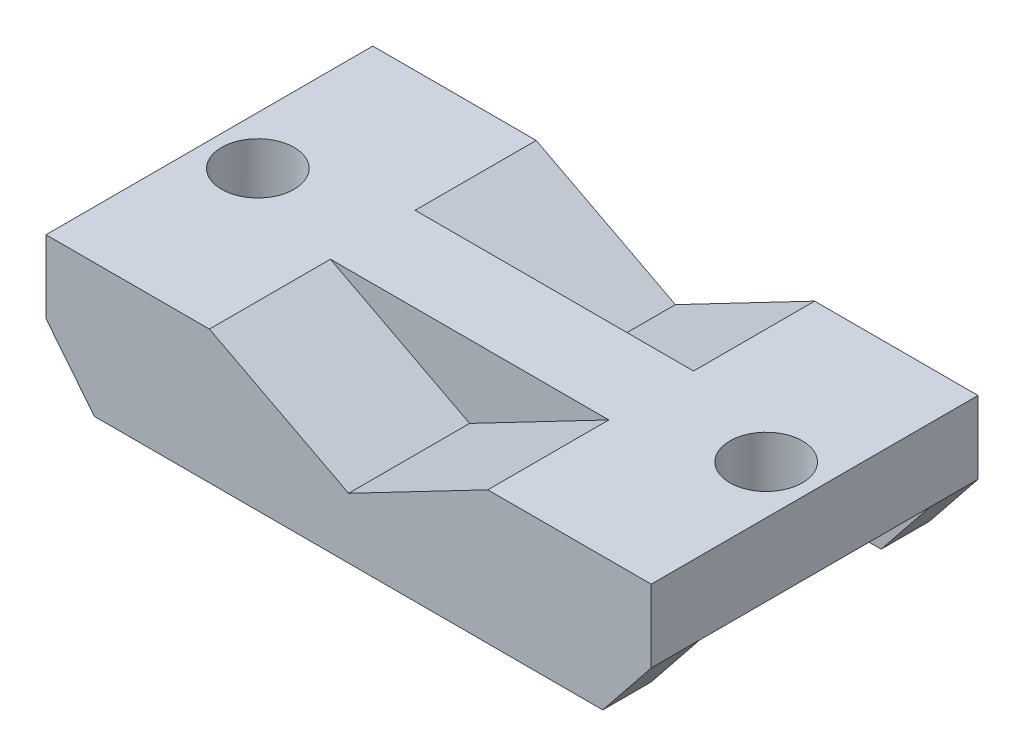
ISO-10303-21;
HEADER;
FILE_DESCRIPTION(('STEP AP214'),'2;1');
FILE_NAME('part.step','',(''),(''),'','','');
FILE_SCHEMA(('AUTOMOTIVE_DESIGN { 1 0 10303 214 1 1 1 1 }'));
ENDSEC;
DATA;
#1=APPLICATION_CONTEXT('core data for automotive mechanical design processes');
#2=APPLICATION_PROTOCOL_DEFINITION('international standard','automotive_design',2000,#1);
#3=PRODUCT_CONTEXT('',#1,'mechanical');
#4=PRODUCT('Part','Part','',(#3));
#5=PRODUCT_RELATED_PRODUCT_CATEGORY('part','',(#4));
#6=PRODUCT_DEFINITION_FORMATION('','',#4);
#7=PRODUCT_DEFINITION_CONTEXT('part definition',#1,'design');
#8=PRODUCT_DEFINITION('design','',#6,#7);
#9=PRODUCT_DEFINITION_SHAPE('','',#8);
#10=(LENGTH_UNIT() NAMED_UNIT(*) SI_UNIT(.MILLI.,.METRE.));
#11=(NAMED_UNIT(*) PLANE_ANGLE_UNIT() SI_UNIT($,.RADIAN.));
#12=(NAMED_UNIT(*) SI_UNIT($,.STERADIAN.) SOLID_ANGLE_UNIT());
#13=UNCERTAINTY_MEASURE_WITH_UNIT(LENGTH_MEASURE(1.E-05),#10,'distance_accuracy_value','');
#14=(GEOMETRIC_REPRESENTATION_CONTEXT(3) GLOBAL_UNCERTAINTY_ASSIGNED_CONTEXT((#13)) GLOBAL_UNIT_ASSIGNED_CONTEXT((#10,
#11,#12)) REPRESENTATION_CONTEXT('',''));
#15=CARTESIAN_POINT('',(0.,0.,0.));
#16=DIRECTION('',(0.,0.,1.));
#17=DIRECTION('',(1.,0.,0.));
#18=AXIS2_PLACEMENT_3D('',#15,#16,#17);
#19=CARTESIAN_POINT('',(30.4878048780488,-24.390243902439,27.));
#20=DIRECTION('',(0.780868809443031,-0.624695047554424,0.));
#21=DIRECTION('',(0.624695047554424,0.780868809443031,0.));
#22=AXIS2_PLACEMENT_3D('',#19,#20,#21);
#23=PLANE('',#22);
#24=DIRECTION('',(0.,0.,-1.));
#25=VECTOR('',#24,1.);
#26=CARTESIAN_POINT('',(42.,-10.,27.));
#27=LINE('',#26,#25);
#28=CARTESIAN_POINT('',(42.,-10.,27.));
#29=VERTEX_POINT('',#28);
#30=CARTESIAN_POINT('',(42.,-10.,19.));
#31=VERTEX_POINT('',#30);
#32=EDGE_CURVE('E377',#29,#31,#27,.T.);
#33=ORIENTED_EDGE('',*,*,#32,.T.);
#34=DIRECTION('',(0.624695047554424,0.780868809443031,0.));
#35=VECTOR('',#34,1.);
#36=CARTESIAN_POINT('',(30.4878048780488,-24.390243902439,19.));
#37=LINE('',#36,#35);
#38=CARTESIAN_POINT('',(50.,0.,19.));
#39=VERTEX_POINT('',#38);
#40=EDGE_CURVE('E57',#31,#39,#37,.T.);
#41=ORIENTED_EDGE('',*,*,#40,.T.);
#42=DIRECTION('',(0.,0.,-1.));
#43=VECTOR('',#42,1.);
#44=CARTESIAN_POINT('',(50.,0.,27.));
#45=LINE('',#44,#43);
#46=CARTESIAN_POINT('',(50.,0.,27.));
#47=VERTEX_POINT('',#46);
#48=EDGE_CURVE('E372',#47,#39,#45,.T.);
#49=ORIENTED_EDGE('',*,*,#48,.F.);
#50=DIRECTION('',(-0.624695047554424,-0.780868809443031,0.));
#51=VECTOR('',#50,1.);
#52=CARTESIAN_POINT('',(30.4878048780488,-24.390243902439,27.));
#53=LINE('',#52,#51);
#54=EDGE_CURVE('E294',#47,#29,#53,.T.);
#55=ORIENTED_EDGE('',*,*,#54,.T.);
#56=EDGE_LOOP('',(#33,#41,#49,#55));
#57=FACE_BOUND('',#56,.T.);
#58=ADVANCED_FACE('F47',(#57),#23,.T.);
#59=CARTESIAN_POINT('',(-30.4878048780488,-24.390243902439,27.));
#60=DIRECTION('',(0.780868809443031,0.624695047554424,0.));
#61=DIRECTION('',(-0.624695047554424,0.780868809443031,0.));
#62=AXIS2_PLACEMENT_3D('',#59,#60,#61);
#63=PLANE('',#62);
#64=DIRECTION('',(-0.624695047554424,0.780868809443031,0.));
#65=VECTOR('',#64,1.);
#66=CARTESIAN_POINT('',(-30.4878048780488,-24.390243902439,19.));
#67=LINE('',#66,#65);
#68=CARTESIAN_POINT('',(-42.,-10.,19.));
#69=VERTEX_POINT('',#68);
#70=CARTESIAN_POINT('',(-50.,0.,19.));
#71=VERTEX_POINT('',#70);
#72=EDGE_CURVE('E247',#69,#71,#67,.T.);
#73=ORIENTED_EDGE('',*,*,#72,.F.);
#74=DIRECTION('',(0.,0.,-1.));
#75=VECTOR('',#74,1.);
#76=CARTESIAN_POINT('',(-42.,-10.,27.));
#77=LINE('',#76,#75);
#78=CARTESIAN_POINT('',(-42.,-10.,27.));
#79=VERTEX_POINT('',#78);
#80=EDGE_CURVE('E382',#79,#69,#77,.T.);
#81=ORIENTED_EDGE('',*,*,#80,.F.);
#82=DIRECTION('',(0.624695047554424,-0.780868809443031,0.));
#83=VECTOR('',#82,1.);
#84=CARTESIAN_POINT('',(-30.4878048780488,-24.390243902439,27.));
#85=LINE('',#84,#83);
#86=CARTESIAN_POINT('',(-50.,0.,27.));
#87=VERTEX_POINT('',#86);
#88=EDGE_CURVE('E286',#87,#79,#85,.T.);
#89=ORIENTED_EDGE('',*,*,#88,.F.);
#90=DIRECTION('',(0.,0.,-1.));
#91=VECTOR('',#90,1.);
#92=CARTESIAN_POINT('',(-50.,0.,27.));
#93=LINE('',#92,#91);
#94=EDGE_CURVE('E387',#87,#71,#93,.T.);
#95=ORIENTED_EDGE('',*,*,#94,.T.);
#96=EDGE_LOOP('',(#73,#81,#89,#95));
#97=FACE_BOUND('',#96,.T.);
#98=ADVANCED_FACE('F480',(#97),#63,.F.);
#99=CARTESIAN_POINT('',(0.,0.,27.));
#100=DIRECTION('',(-0.46256600669502,0.886584846165455,0.));
#101=DIRECTION('',(-0.886584846165455,-0.46256600669502,0.));
#102=AXIS2_PLACEMENT_3D('',#99,#100,#101);
#103=PLANE('',#102);
#104=DIRECTION('',(0.,0.,-1.));
#105=VECTOR('',#104,1.);
#106=CARTESIAN_POINT('',(0.,0.,27.));
#107=LINE('',#106,#105);
#108=CARTESIAN_POINT('',(0.,0.,-7.));
#109=VERTEX_POINT('',#108);
#110=CARTESIAN_POINT('',(0.,0.,-27.));
#111=VERTEX_POINT('',#110);
#112=EDGE_CURVE('E358',#109,#111,#107,.T.);
#113=ORIENTED_EDGE('',*,*,#112,.F.);
#114=DIRECTION('',(0.886584846165455,0.46256600669502,0.));
#115=VECTOR('',#114,1.);
#116=CARTESIAN_POINT('',(0.,0.,-7.));
#117=LINE('',#116,#115);
#118=CARTESIAN_POINT('',(23.,12.,-7.));
#119=VERTEX_POINT('',#118);
#120=EDGE_CURVE('E265',#109,#119,#117,.T.);
#121=ORIENTED_EDGE('',*,*,#120,.T.);
#122=DIRECTION('',(0.,0.,-1.));
#123=VECTOR('',#122,1.);
#124=CARTESIAN_POINT('',(23.,12.,27.));
#125=LINE('',#124,#123);
#126=CARTESIAN_POINT('',(23.,12.,-27.));
#127=VERTEX_POINT('',#126);
#128=EDGE_CURVE('E363',#119,#127,#125,.T.);
#129=ORIENTED_EDGE('',*,*,#128,.T.);
#130=DIRECTION('',(0.886584846165455,0.46256600669502,0.));
#131=VECTOR('',#130,1.);
#132=CARTESIAN_POINT('',(0.,0.,-27.));
#133=LINE('',#132,#131);
#134=EDGE_CURVE('E340',#111,#127,#133,.T.);
#135=ORIENTED_EDGE('',*,*,#134,.F.);
#136=EDGE_LOOP('',(#113,#121,#129,#135));
#137=FACE_BOUND('',#136,.T.);
#138=ADVANCED_FACE('F453',(#137),#103,.T.);
#139=CARTESIAN_POINT('',(0.,0.,27.));
#140=DIRECTION('',(-0.46256600669502,-0.886584846165455,0.));
#141=DIRECTION('',(0.886584846165455,-0.46256600669502,0.));
#142=AXIS2_PLACEMENT_3D('',#139,#140,#141);
#143=PLANE('',#142);
#144=DIRECTION('',(-0.886584846165455,0.46256600669502,0.));
#145=VECTOR('',#144,1.);
#146=CARTESIAN_POINT('',(0.,0.,-7.));
#147=LINE('',#146,#145);
#148=CARTESIAN_POINT('',(-23.,12.,-7.));
#149=VERTEX_POINT('',#148);
#150=EDGE_CURVE('E276',#109,#149,#147,.T.);
#151=ORIENTED_EDGE('',*,*,#150,.F.);
#152=ORIENTED_EDGE('',*,*,#112,.T.);
#153=DIRECTION('',(-0.886584846165455,0.46256600669502,0.));
#154=VECTOR('',#153,1.);
#155=CARTESIAN_POINT('',(0.,0.,-27.));
#156=LINE('',#155,#154);
#157=CARTESIAN_POINT('',(-23.,12.,-27.));
#158=VERTEX_POINT('',#157);
#159=EDGE_CURVE('E344',#111,#158,#156,.T.);
#160=ORIENTED_EDGE('',*,*,#159,.T.);
#161=DIRECTION('',(0.,0.,-1.));
#162=VECTOR('',#161,1.);
#163=CARTESIAN_POINT('',(-23.,12.,27.));
#164=LINE('',#163,#162);
#165=EDGE_CURVE('E353',#149,#158,#164,.T.);
#166=ORIENTED_EDGE('',*,*,#165,.F.);
#167=EDGE_LOOP('',(#151,#152,#160,#166));
#168=FACE_BOUND('',#167,.T.);
#169=ADVANCED_FACE('F450',(#168),#143,.F.);
#170=CARTESIAN_POINT('',(-50.,0.,27.));
#171=DIRECTION('',(1.,0.,0.));
#172=DIRECTION('',(0.,0.,-1.));
#173=AXIS2_PLACEMENT_3D('',#170,#171,#172);
#174=PLANE('',#173);
#175=DIRECTION('',(0.,-1.,0.));
#176=VECTOR('',#175,1.);
#177=CARTESIAN_POINT('',(-50.,0.,-27.));
#178=LINE('',#177,#176);
#179=CARTESIAN_POINT('',(-50.,12.,-27.));
#180=VERTEX_POINT('',#179);
#181=CARTESIAN_POINT('',(-50.,0.,-27.));
#182=VERTEX_POINT('',#181);
#183=EDGE_CURVE('E272',#180,#182,#178,.T.);
#184=ORIENTED_EDGE('',*,*,#183,.T.);
#185=CARTESIAN_POINT('',(-50.,0.,-19.));
#186=VERTEX_POINT('',#185);
#187=EDGE_CURVE('E386',#186,#182,#93,.T.);
#188=ORIENTED_EDGE('',*,*,#187,.F.);
#189=DIRECTION('',(0.,0.,1.));
#190=VECTOR('',#189,1.);
#191=CARTESIAN_POINT('',(-50.,0.,-19.));
#192=LINE('',#191,#190);
#193=EDGE_CURVE('E243',#186,#71,#192,.T.);
#194=ORIENTED_EDGE('',*,*,#193,.T.);
#195=ORIENTED_EDGE('',*,*,#94,.F.);
#196=DIRECTION('',(0.,-1.,0.));
#197=VECTOR('',#196,1.);
#198=CARTESIAN_POINT('',(-50.,0.,27.));
#199=LINE('',#198,#197);
#200=CARTESIAN_POINT('',(-50.,12.,27.));
#201=VERTEX_POINT('',#200);
#202=EDGE_CURVE('E282',#201,#87,#199,.T.);
#203=ORIENTED_EDGE('',*,*,#202,.F.);
#204=DIRECTION('',(0.,0.,-1.));
#205=VECTOR('',#204,1.);
#206=CARTESIAN_POINT('',(-50.,12.,27.));
#207=LINE('',#206,#205);
#208=EDGE_CURVE('E316',#201,#180,#207,.T.);
#209=ORIENTED_EDGE('',*,*,#208,.T.);
#210=EDGE_LOOP('',(#184,#188,#194,#195,#203,#209));
#211=FACE_BOUND('',#210,.T.);
#212=ADVANCED_FACE('F49',(#211),#174,.F.);
#213=CARTESIAN_POINT('',(-42.,-10.,-19.));
#214=VERTEX_POINT('',#213);
#215=CARTESIAN_POINT('',(-42.,-10.,-27.));
#216=VERTEX_POINT('',#215);
#217=EDGE_CURVE('E381',#214,#216,#77,.T.);
#218=ORIENTED_EDGE('',*,*,#217,.F.);
#219=DIRECTION('',(-0.624695047554424,0.780868809443031,0.));
#220=VECTOR('',#219,1.);
#221=CARTESIAN_POINT('',(-30.4878048780488,-24.390243902439,-19.));
#222=LINE('',#221,#220);
#223=EDGE_CURVE('E256',#214,#186,#222,.T.);
#224=ORIENTED_EDGE('',*,*,#223,.T.);
#225=ORIENTED_EDGE('',*,*,#187,.T.);
#226=DIRECTION('',(0.624695047554424,-0.780868809443031,0.));
#227=VECTOR('',#226,1.);
#228=CARTESIAN_POINT('',(-30.4878048780488,-24.390243902439,-27.));
#229=LINE('',#228,#227);
#230=EDGE_CURVE('E320',#182,#216,#229,.T.);
#231=ORIENTED_EDGE('',*,*,#230,.T.);
#232=EDGE_LOOP('',(#218,#224,#225,#231));
#233=FACE_BOUND('',#232,.T.);
#234=ADVANCED_FACE('F439',(#233),#63,.F.);
#235=CARTESIAN_POINT('',(0.,-10.,27.));
#236=DIRECTION('',(0.,-1.,0.));
#237=DIRECTION('',(0.,0.,-1.));
#238=AXIS2_PLACEMENT_3D('',#235,#236,#237);
#239=PLANE('',#238);
#240=DIRECTION('',(-1.,0.,0.));
#241=VECTOR('',#240,1.);
#242=CARTESIAN_POINT('',(32.,-10.,-19.));
#243=LINE('',#242,#241);
#244=CARTESIAN_POINT('',(42.,-10.,-19.));
#245=VERTEX_POINT('',#244);
#246=CARTESIAN_POINT('',(32.,-10.,-19.));
#247=VERTEX_POINT('',#246);
#248=EDGE_CURVE('E209',#245,#247,#243,.T.);
#249=ORIENTED_EDGE('',*,*,#248,.T.);
#250=DIRECTION('',(0.,0.,1.));
#251=VECTOR('',#250,1.);
#252=CARTESIAN_POINT('',(32.,-10.,-19.));
#253=LINE('',#252,#251);
#254=CARTESIAN_POINT('',(32.,-10.,19.));
#255=VERTEX_POINT('',#254);
#256=EDGE_CURVE('E194',#247,#255,#253,.T.);
#257=ORIENTED_EDGE('',*,*,#256,.T.);
#258=DIRECTION('',(1.,0.,0.));
#259=VECTOR('',#258,1.);
#260=CARTESIAN_POINT('',(32.,-10.,19.));
#261=LINE('',#260,#259);
#262=EDGE_CURVE('E212',#255,#31,#261,.T.);
#263=ORIENTED_EDGE('',*,*,#262,.T.);
#264=ORIENTED_EDGE('',*,*,#32,.F.);
#265=DIRECTION('',(-1.,0.,0.));
#266=VECTOR('',#265,1.);
#267=CARTESIAN_POINT('',(0.,-10.,27.));
#268=LINE('',#267,#266);
#269=EDGE_CURVE('E290',#29,#79,#268,.T.);
#270=ORIENTED_EDGE('',*,*,#269,.T.);
#271=ORIENTED_EDGE('',*,*,#80,.T.);
#272=DIRECTION('',(-1.,0.,0.));
#273=VECTOR('',#272,1.);
#274=CARTESIAN_POINT('',(-32.,-10.,19.));
#275=LINE('',#274,#273);
#276=CARTESIAN_POINT('',(-32.,-10.,19.));
#277=VERTEX_POINT('',#276);
#278=EDGE_CURVE('E225',#277,#69,#275,.T.);
#279=ORIENTED_EDGE('',*,*,#278,.F.);
#280=DIRECTION('',(0.,0.,1.));
#281=VECTOR('',#280,1.);
#282=CARTESIAN_POINT('',(-32.,-10.,-19.));
#283=LINE('',#282,#281);
#284=CARTESIAN_POINT('',(-32.,-10.,-19.));
#285=VERTEX_POINT('',#284);
#286=EDGE_CURVE('E72',#285,#277,#283,.T.);
#287=ORIENTED_EDGE('',*,*,#286,.F.);
#288=DIRECTION('',(1.,0.,0.));
#289=VECTOR('',#288,1.);
#290=CARTESIAN_POINT('',(0.,-10.,-19.));
#291=LINE('',#290,#289);
#292=EDGE_CURVE('E391',#214,#285,#291,.T.);
#293=ORIENTED_EDGE('',*,*,#292,.F.);
#294=ORIENTED_EDGE('',*,*,#217,.T.);
#295=DIRECTION('',(-1.,0.,0.));
#296=VECTOR('',#295,1.);
#297=CARTESIAN_POINT('',(0.,-10.,-27.));
#298=LINE('',#297,#296);
#299=CARTESIAN_POINT('',(42.,-10.,-27.));
#300=VERTEX_POINT('',#299);
#301=EDGE_CURVE('E324',#300,#216,#298,.T.);
#302=ORIENTED_EDGE('',*,*,#301,.F.);
#303=EDGE_CURVE('E376',#245,#300,#27,.T.);
#304=ORIENTED_EDGE('',*,*,#303,.F.);
#305=EDGE_LOOP('',(#249,#257,#263,#264,#270,#271,#279,#287,#293,#294,#302,#304));
#306=FACE_BOUND('',#305,.T.);
#307=ADVANCED_FACE('F466',(#306),#239,.T.);
#308=DIRECTION('',(0.624695047554424,0.780868809443031,0.));
#309=VECTOR('',#308,1.);
#310=CARTESIAN_POINT('',(30.4878048780488,-24.390243902439,-19.));
#311=LINE('',#310,#309);
#312=CARTESIAN_POINT('',(50.,0.,-19.));
#313=VERTEX_POINT('',#312);
#314=EDGE_CURVE('E11',#245,#313,#311,.T.);
#315=ORIENTED_EDGE('',*,*,#314,.F.);
#316=ORIENTED_EDGE('',*,*,#303,.T.);
#317=DIRECTION('',(-0.624695047554424,-0.780868809443031,0.));
#318=VECTOR('',#317,1.);
#319=CARTESIAN_POINT('',(30.4878048780488,-24.390243902439,-27.));
#320=LINE('',#319,#318);
#321=CARTESIAN_POINT('',(50.,0.,-27.));
#322=VERTEX_POINT('',#321);
#323=EDGE_CURVE('E328',#322,#300,#320,.T.);
#324=ORIENTED_EDGE('',*,*,#323,.F.);
#325=EDGE_CURVE('E371',#313,#322,#45,.T.);
#326=ORIENTED_EDGE('',*,*,#325,.F.);
#327=EDGE_LOOP('',(#315,#316,#324,#326));
#328=FACE_BOUND('',#327,.T.);
#329=ADVANCED_FACE('F463',(#328),#23,.T.);
#330=CARTESIAN_POINT('',(50.,0.,27.));
#331=DIRECTION('',(1.,0.,0.));
#332=DIRECTION('',(0.,0.,-1.));
#333=AXIS2_PLACEMENT_3D('',#330,#331,#332);
#334=PLANE('',#333);
#335=DIRECTION('',(0.,-1.,0.));
#336=VECTOR('',#335,1.);
#337=CARTESIAN_POINT('',(50.,0.,-27.));
#338=LINE('',#337,#336);
#339=CARTESIAN_POINT('',(50.,12.,-27.));
#340=VERTEX_POINT('',#339);
#341=EDGE_CURVE('E332',#340,#322,#338,.T.);
#342=ORIENTED_EDGE('',*,*,#341,.F.);
#343=DIRECTION('',(0.,0.,-1.));
#344=VECTOR('',#343,1.);
#345=CARTESIAN_POINT('',(50.,12.,27.));
#346=LINE('',#345,#344);
#347=CARTESIAN_POINT('',(50.,12.,27.));
#348=VERTEX_POINT('',#347);
#349=EDGE_CURVE('E368',#348,#340,#346,.T.);
#350=ORIENTED_EDGE('',*,*,#349,.F.);
#351=DIRECTION('',(0.,-1.,0.));
#352=VECTOR('',#351,1.);
#353=CARTESIAN_POINT('',(50.,0.,27.));
#354=LINE('',#353,#352);
#355=EDGE_CURVE('E298',#348,#47,#354,.T.);
#356=ORIENTED_EDGE('',*,*,#355,.T.);
#357=ORIENTED_EDGE('',*,*,#48,.T.);
#358=DIRECTION('',(0.,0.,1.));
#359=VECTOR('',#358,1.);
#360=CARTESIAN_POINT('',(50.,0.,-19.));
#361=LINE('',#360,#359);
#362=EDGE_CURVE('E195',#313,#39,#361,.T.);
#363=ORIENTED_EDGE('',*,*,#362,.F.);
#364=ORIENTED_EDGE('',*,*,#325,.T.);
#365=EDGE_LOOP('',(#342,#350,#356,#357,#363,#364));
#366=FACE_BOUND('',#365,.T.);
#367=ADVANCED_FACE('F459',(#366),#334,.T.);
#368=DIRECTION('',(0.886584846165455,0.46256600669502,0.));
#369=VECTOR('',#368,1.);
#370=CARTESIAN_POINT('',(0.,0.,7.));
#371=LINE('',#370,#369);
#372=CARTESIAN_POINT('',(0.,0.,7.));
#373=VERTEX_POINT('',#372);
#374=CARTESIAN_POINT('',(23.,12.,7.));
#375=VERTEX_POINT('',#374);
#376=EDGE_CURVE('E269',#373,#375,#371,.T.);
#377=ORIENTED_EDGE('',*,*,#376,.F.);
#378=CARTESIAN_POINT('',(0.,0.,27.));
#379=VERTEX_POINT('',#378);
#380=EDGE_CURVE('E359',#379,#373,#107,.T.);
#381=ORIENTED_EDGE('',*,*,#380,.F.);
#382=DIRECTION('',(0.886584846165455,0.46256600669502,0.));
#383=VECTOR('',#382,1.);
#384=CARTESIAN_POINT('',(0.,0.,27.));
#385=LINE('',#384,#383);
#386=CARTESIAN_POINT('',(23.,12.,27.));
#387=VERTEX_POINT('',#386);
#388=EDGE_CURVE('E306',#379,#387,#385,.T.);
#389=ORIENTED_EDGE('',*,*,#388,.T.);
#390=EDGE_CURVE('E364',#387,#375,#125,.T.);
#391=ORIENTED_EDGE('',*,*,#390,.T.);
#392=EDGE_LOOP('',(#377,#381,#389,#391));
#393=FACE_BOUND('',#392,.T.);
#394=ADVANCED_FACE('F493',(#393),#103,.T.);
#395=ORIENTED_EDGE('',*,*,#380,.T.);
#396=DIRECTION('',(-0.886584846165455,0.46256600669502,0.));
#397=VECTOR('',#396,1.);
#398=CARTESIAN_POINT('',(0.,0.,7.));
#399=LINE('',#398,#397);
#400=CARTESIAN_POINT('',(-23.,12.,7.));
#401=VERTEX_POINT('',#400);
#402=EDGE_CURVE('E264',#373,#401,#399,.T.);
#403=ORIENTED_EDGE('',*,*,#402,.T.);
#404=CARTESIAN_POINT('',(-23.,12.,27.));
#405=VERTEX_POINT('',#404);
#406=EDGE_CURVE('E354',#405,#401,#164,.T.);
#407=ORIENTED_EDGE('',*,*,#406,.F.);
#408=DIRECTION('',(-0.886584846165455,0.46256600669502,0.));
#409=VECTOR('',#408,1.);
#410=CARTESIAN_POINT('',(0.,0.,27.));
#411=LINE('',#410,#409);
#412=EDGE_CURVE('E310',#379,#405,#411,.T.);
#413=ORIENTED_EDGE('',*,*,#412,.F.);
#414=EDGE_LOOP('',(#395,#403,#407,#413));
#415=FACE_BOUND('',#414,.T.);
#416=ADVANCED_FACE('F420',(#415),#143,.F.);
#417=CARTESIAN_POINT('',(0.,12.,27.));
#418=DIRECTION('',(0.,-1.,0.));
#419=DIRECTION('',(1.,0.,0.));
#420=AXIS2_PLACEMENT_3D('',#417,#418,#419);
#421=PLANE('',#420);
#422=CARTESIAN_POINT('',(42.,12.,0.));
#423=DIRECTION('',(0.,1.,0.));
#424=DIRECTION('',(-1.,0.,0.));
#425=AXIS2_PLACEMENT_3D('',#422,#423,#424);
#426=CIRCLE('',#425,5.99999999999999);
#427=CARTESIAN_POINT('',(36.,12.,0.));
#428=VERTEX_POINT('',#427);
#429=EDGE_CURVE('E399',#428,#428,#426,.T.);
#430=ORIENTED_EDGE('',*,*,#429,.F.);
#431=EDGE_LOOP('',(#430));
#432=FACE_BOUND('',#431,.T.);
#433=CARTESIAN_POINT('',(-42.,12.,0.));
#434=DIRECTION('',(0.,1.,0.));
#435=DIRECTION('',(1.,0.,0.));
#436=AXIS2_PLACEMENT_3D('',#433,#434,#435);
#437=CIRCLE('',#436,5.99999999999999);
#438=CARTESIAN_POINT('',(-36.,12.,0.));
#439=VERTEX_POINT('',#438);
#440=EDGE_CURVE('E406',#439,#439,#437,.T.);
#441=ORIENTED_EDGE('',*,*,#440,.F.);
#442=EDGE_LOOP('',(#441));
#443=FACE_BOUND('',#442,.T.);
#444=DIRECTION('',(-1.,0.,0.));
#445=VECTOR('',#444,1.);
#446=CARTESIAN_POINT('',(0.,12.,-27.));
#447=LINE('',#446,#445);
#448=EDGE_CURVE('E287',#158,#180,#447,.T.);
#449=ORIENTED_EDGE('',*,*,#448,.T.);
#450=ORIENTED_EDGE('',*,*,#208,.F.);
#451=DIRECTION('',(-1.,0.,0.));
#452=VECTOR('',#451,1.);
#453=CARTESIAN_POINT('',(0.,12.,27.));
#454=LINE('',#453,#452);
#455=EDGE_CURVE('E313',#405,#201,#454,.T.);
#456=ORIENTED_EDGE('',*,*,#455,.F.);
#457=ORIENTED_EDGE('',*,*,#406,.T.);
#458=DIRECTION('',(-1.,0.,0.));
#459=VECTOR('',#458,1.);
#460=CARTESIAN_POINT('',(0.,12.,7.));
#461=LINE('',#460,#459);
#462=EDGE_CURVE('E261',#375,#401,#461,.T.);
#463=ORIENTED_EDGE('',*,*,#462,.F.);
#464=ORIENTED_EDGE('',*,*,#390,.F.);
#465=DIRECTION('',(1.,0.,0.));
#466=VECTOR('',#465,1.);
#467=CARTESIAN_POINT('',(0.,12.,27.));
#468=LINE('',#467,#466);
#469=EDGE_CURVE('E302',#387,#348,#468,.T.);
#470=ORIENTED_EDGE('',*,*,#469,.T.);
#471=ORIENTED_EDGE('',*,*,#349,.T.);
#472=DIRECTION('',(1.,0.,0.));
#473=VECTOR('',#472,1.);
#474=CARTESIAN_POINT('',(0.,12.,-27.));
#475=LINE('',#474,#473);
#476=EDGE_CURVE('E336',#127,#340,#475,.T.);
#477=ORIENTED_EDGE('',*,*,#476,.F.);
#478=ORIENTED_EDGE('',*,*,#128,.F.);
#479=DIRECTION('',(-1.,0.,0.));
#480=VECTOR('',#479,1.);
#481=CARTESIAN_POINT('',(0.,12.,-7.));
#482=LINE('',#481,#480);
#483=EDGE_CURVE('E260',#119,#149,#482,.T.);
#484=ORIENTED_EDGE('',*,*,#483,.T.);
#485=ORIENTED_EDGE('',*,*,#165,.T.);
#486=EDGE_LOOP('',(#449,#450,#456,#457,#463,#464,#470,#471,#477,#478,#484,#485));
#487=FACE_BOUND('',#486,.T.);
#488=ADVANCED_FACE('F416',(#432,#443,#487),#421,.F.);
#489=CARTESIAN_POINT('',(0.,0.,27.));
#490=DIRECTION('',(0.,0.,1.));
#491=DIRECTION('',(1.,0.,0.));
#492=AXIS2_PLACEMENT_3D('',#489,#490,#491);
#493=PLANE('',#492);
#494=ORIENTED_EDGE('',*,*,#202,.T.);
#495=ORIENTED_EDGE('',*,*,#88,.T.);
#496=ORIENTED_EDGE('',*,*,#269,.F.);
#497=ORIENTED_EDGE('',*,*,#54,.F.);
#498=ORIENTED_EDGE('',*,*,#355,.F.);
#499=ORIENTED_EDGE('',*,*,#469,.F.);
#500=ORIENTED_EDGE('',*,*,#388,.F.);
#501=ORIENTED_EDGE('',*,*,#412,.T.);
#502=ORIENTED_EDGE('',*,*,#455,.T.);
#503=EDGE_LOOP('',(#494,#495,#496,#497,#498,#499,#500,#501,#502));
#504=FACE_BOUND('',#503,.T.);
#505=ADVANCED_FACE('F419',(#504),#493,.T.);
#506=CARTESIAN_POINT('',(0.,0.,-27.));
#507=DIRECTION('',(0.,0.,1.));
#508=DIRECTION('',(1.,0.,0.));
#509=AXIS2_PLACEMENT_3D('',#506,#507,#508);
#510=PLANE('',#509);
#511=ORIENTED_EDGE('',*,*,#183,.F.);
#512=ORIENTED_EDGE('',*,*,#448,.F.);
#513=ORIENTED_EDGE('',*,*,#159,.F.);
#514=ORIENTED_EDGE('',*,*,#134,.T.);
#515=ORIENTED_EDGE('',*,*,#476,.T.);
#516=ORIENTED_EDGE('',*,*,#341,.T.);
#517=ORIENTED_EDGE('',*,*,#323,.T.);
#518=ORIENTED_EDGE('',*,*,#301,.T.);
#519=ORIENTED_EDGE('',*,*,#230,.F.);
#520=EDGE_LOOP('',(#511,#512,#513,#514,#515,#516,#517,#518,#519));
#521=FACE_BOUND('',#520,.T.);
#522=ADVANCED_FACE('F435',(#521),#510,.F.);
#523=CARTESIAN_POINT('',(0.,0.,7.));
#524=DIRECTION('',(0.,0.,1.));
#525=DIRECTION('',(1.,0.,0.));
#526=AXIS2_PLACEMENT_3D('',#523,#524,#525);
#527=PLANE('',#526);
#528=ORIENTED_EDGE('',*,*,#462,.T.);
#529=ORIENTED_EDGE('',*,*,#402,.F.);
#530=ORIENTED_EDGE('',*,*,#376,.T.);
#531=EDGE_LOOP('',(#528,#529,#530));
#532=FACE_BOUND('',#531,.T.);
#533=ADVANCED_FACE('F491',(#532),#527,.T.);
#534=CARTESIAN_POINT('',(0.,0.,-7.));
#535=DIRECTION('',(0.,0.,1.));
#536=DIRECTION('',(1.,0.,0.));
#537=AXIS2_PLACEMENT_3D('',#534,#535,#536);
#538=PLANE('',#537);
#539=ORIENTED_EDGE('',*,*,#483,.F.);
#540=ORIENTED_EDGE('',*,*,#120,.F.);
#541=ORIENTED_EDGE('',*,*,#150,.T.);
#542=EDGE_LOOP('',(#539,#540,#541));
#543=FACE_BOUND('',#542,.T.);
#544=ADVANCED_FACE('F511',(#543),#538,.F.);
#545=CARTESIAN_POINT('',(0.,0.,-19.));
#546=DIRECTION('',(0.,0.,-1.));
#547=DIRECTION('',(-1.,0.,0.));
#548=AXIS2_PLACEMENT_3D('',#545,#546,#547);
#549=PLANE('',#548);
#550=ORIENTED_EDGE('',*,*,#292,.T.);
#551=DIRECTION('',(0.,-1.,0.));
#552=VECTOR('',#551,1.);
#553=CARTESIAN_POINT('',(-32.,0.,-19.));
#554=LINE('',#553,#552);
#555=CARTESIAN_POINT('',(-32.,0.,-19.));
#556=VERTEX_POINT('',#555);
#557=EDGE_CURVE('E229',#556,#285,#554,.T.);
#558=ORIENTED_EDGE('',*,*,#557,.F.);
#559=DIRECTION('',(1.,0.,0.));
#560=VECTOR('',#559,1.);
#561=CARTESIAN_POINT('',(-32.,0.,-19.));
#562=LINE('',#561,#560);
#563=EDGE_CURVE('E232',#186,#556,#562,.T.);
#564=ORIENTED_EDGE('',*,*,#563,.F.);
#565=ORIENTED_EDGE('',*,*,#223,.F.);
#566=EDGE_LOOP('',(#550,#558,#564,#565));
#567=FACE_BOUND('',#566,.T.);
#568=ADVANCED_FACE('F471',(#567),#549,.F.);
#569=CARTESIAN_POINT('',(0.,0.,19.));
#570=DIRECTION('',(0.,0.,-1.));
#571=DIRECTION('',(-1.,0.,0.));
#572=AXIS2_PLACEMENT_3D('',#569,#570,#571);
#573=PLANE('',#572);
#574=ORIENTED_EDGE('',*,*,#72,.T.);
#575=DIRECTION('',(1.,0.,0.));
#576=VECTOR('',#575,1.);
#577=CARTESIAN_POINT('',(-32.,0.,19.));
#578=LINE('',#577,#576);
#579=CARTESIAN_POINT('',(-32.,0.,19.));
#580=VERTEX_POINT('',#579);
#581=EDGE_CURVE('E233',#71,#580,#578,.T.);
#582=ORIENTED_EDGE('',*,*,#581,.T.);
#583=DIRECTION('',(0.,-1.,0.));
#584=VECTOR('',#583,1.);
#585=CARTESIAN_POINT('',(-32.,0.,19.));
#586=LINE('',#585,#584);
#587=EDGE_CURVE('E238',#580,#277,#586,.T.);
#588=ORIENTED_EDGE('',*,*,#587,.T.);
#589=ORIENTED_EDGE('',*,*,#278,.T.);
#590=EDGE_LOOP('',(#574,#582,#588,#589));
#591=FACE_BOUND('',#590,.T.);
#592=ADVANCED_FACE('F501',(#591),#573,.T.);
#593=CARTESIAN_POINT('',(-32.,0.,-19.));
#594=DIRECTION('',(0.,-1.,0.));
#595=DIRECTION('',(0.,0.,-1.));
#596=AXIS2_PLACEMENT_3D('',#593,#594,#595);
#597=PLANE('',#596);
#598=CARTESIAN_POINT('',(-42.,0.,0.));
#599=DIRECTION('',(0.,-1.,0.));
#600=DIRECTION('',(0.,0.,-1.));
#601=AXIS2_PLACEMENT_3D('',#598,#599,#600);
#602=CIRCLE('',#601,5.99999999999999);
#603=CARTESIAN_POINT('',(-42.,0.,-5.99999999999999));
#604=VERTEX_POINT('',#603);
#605=EDGE_CURVE('E51',#604,#604,#602,.T.);
#606=ORIENTED_EDGE('',*,*,#605,.F.);
#607=EDGE_LOOP('',(#606));
#608=FACE_BOUND('',#607,.T.);
#609=ORIENTED_EDGE('',*,*,#581,.F.);
#610=ORIENTED_EDGE('',*,*,#193,.F.);
#611=ORIENTED_EDGE('',*,*,#563,.T.);
#612=DIRECTION('',(0.,0.,1.));
#613=VECTOR('',#612,1.);
#614=CARTESIAN_POINT('',(-32.,0.,-19.));
#615=LINE('',#614,#613);
#616=EDGE_CURVE('E248',#556,#580,#615,.T.);
#617=ORIENTED_EDGE('',*,*,#616,.T.);
#618=EDGE_LOOP('',(#609,#610,#611,#617));
#619=FACE_BOUND('',#618,.T.);
#620=ADVANCED_FACE('F477',(#608,#619),#597,.T.);
#621=CARTESIAN_POINT('',(-32.,0.,-19.));
#622=DIRECTION('',(-1.,0.,0.));
#623=DIRECTION('',(0.,-1.,0.));
#624=AXIS2_PLACEMENT_3D('',#621,#622,#623);
#625=PLANE('',#624);
#626=ORIENTED_EDGE('',*,*,#587,.F.);
#627=ORIENTED_EDGE('',*,*,#616,.F.);
#628=ORIENTED_EDGE('',*,*,#557,.T.);
#629=ORIENTED_EDGE('',*,*,#286,.T.);
#630=EDGE_LOOP('',(#626,#627,#628,#629));
#631=FACE_BOUND('',#630,.T.);
#632=ADVANCED_FACE('F474',(#631),#625,.T.);
#633=CARTESIAN_POINT('',(32.,0.,-19.));
#634=DIRECTION('',(-1.,0.,0.));
#635=DIRECTION('',(0.,-1.,0.));
#636=AXIS2_PLACEMENT_3D('',#633,#634,#635);
#637=PLANE('',#636);
#638=DIRECTION('',(0.,-1.,0.));
#639=VECTOR('',#638,1.);
#640=CARTESIAN_POINT('',(32.,0.,19.));
#641=LINE('',#640,#639);
#642=CARTESIAN_POINT('',(32.,0.,19.));
#643=VERTEX_POINT('',#642);
#644=EDGE_CURVE('E218',#643,#255,#641,.T.);
#645=ORIENTED_EDGE('',*,*,#644,.T.);
#646=ORIENTED_EDGE('',*,*,#256,.F.);
#647=DIRECTION('',(0.,-1.,0.));
#648=VECTOR('',#647,1.);
#649=CARTESIAN_POINT('',(32.,0.,-19.));
#650=LINE('',#649,#648);
#651=CARTESIAN_POINT('',(32.,0.,-19.));
#652=VERTEX_POINT('',#651);
#653=EDGE_CURVE('E198',#652,#247,#650,.T.);
#654=ORIENTED_EDGE('',*,*,#653,.F.);
#655=DIRECTION('',(0.,0.,1.));
#656=VECTOR('',#655,1.);
#657=CARTESIAN_POINT('',(32.,0.,-19.));
#658=LINE('',#657,#656);
#659=EDGE_CURVE('E186',#652,#643,#658,.T.);
#660=ORIENTED_EDGE('',*,*,#659,.T.);
#661=EDGE_LOOP('',(#645,#646,#654,#660));
#662=FACE_BOUND('',#661,.T.);
#663=ADVANCED_FACE('F199',(#662),#637,.F.);
#664=CARTESIAN_POINT('',(32.,0.,-19.));
#665=DIRECTION('',(0.,1.,0.));
#666=DIRECTION('',(0.,0.,1.));
#667=AXIS2_PLACEMENT_3D('',#664,#665,#666);
#668=PLANE('',#667);
#669=CARTESIAN_POINT('',(42.,0.,0.));
#670=DIRECTION('',(0.,1.,0.));
#671=DIRECTION('',(0.,0.,1.));
#672=AXIS2_PLACEMENT_3D('',#669,#670,#671);
#673=CIRCLE('',#672,5.99999999999999);
#674=CARTESIAN_POINT('',(42.,0.,5.99999999999999));
#675=VERTEX_POINT('',#674);
#676=EDGE_CURVE('E396',#675,#675,#673,.T.);
#677=ORIENTED_EDGE('',*,*,#676,.T.);
#678=EDGE_LOOP('',(#677));
#679=FACE_BOUND('',#678,.T.);
#680=DIRECTION('',(-1.,0.,0.));
#681=VECTOR('',#680,1.);
#682=CARTESIAN_POINT('',(32.,0.,19.));
#683=LINE('',#682,#681);
#684=EDGE_CURVE('E190',#39,#643,#683,.T.);
#685=ORIENTED_EDGE('',*,*,#684,.T.);
#686=ORIENTED_EDGE('',*,*,#659,.F.);
#687=DIRECTION('',(-1.,0.,0.));
#688=VECTOR('',#687,1.);
#689=CARTESIAN_POINT('',(32.,0.,-19.));
#690=LINE('',#689,#688);
#691=EDGE_CURVE('E65',#313,#652,#690,.T.);
#692=ORIENTED_EDGE('',*,*,#691,.F.);
#693=ORIENTED_EDGE('',*,*,#362,.T.);
#694=EDGE_LOOP('',(#685,#686,#692,#693));
#695=FACE_BOUND('',#694,.T.);
#696=ADVANCED_FACE('F188',(#679,#695),#668,.F.);
#697=CARTESIAN_POINT('',(0.,0.,-19.));
#698=DIRECTION('',(0.,0.,-1.));
#699=DIRECTION('',(1.,0.,0.));
#700=AXIS2_PLACEMENT_3D('',#697,#698,#699);
#701=PLANE('',#700);
#702=ORIENTED_EDGE('',*,*,#314,.T.);
#703=ORIENTED_EDGE('',*,*,#691,.T.);
#704=ORIENTED_EDGE('',*,*,#653,.T.);
#705=ORIENTED_EDGE('',*,*,#248,.F.);
#706=EDGE_LOOP('',(#702,#703,#704,#705));
#707=FACE_BOUND('',#706,.T.);
#708=ADVANCED_FACE('F205',(#707),#701,.F.);
#709=CARTESIAN_POINT('',(0.,0.,19.));
#710=DIRECTION('',(0.,0.,-1.));
#711=DIRECTION('',(1.,0.,0.));
#712=AXIS2_PLACEMENT_3D('',#709,#710,#711);
#713=PLANE('',#712);
#714=ORIENTED_EDGE('',*,*,#262,.F.);
#715=ORIENTED_EDGE('',*,*,#644,.F.);
#716=ORIENTED_EDGE('',*,*,#684,.F.);
#717=ORIENTED_EDGE('',*,*,#40,.F.);
#718=EDGE_LOOP('',(#714,#715,#716,#717));
#719=FACE_BOUND('',#718,.T.);
#720=ADVANCED_FACE('F499',(#719),#713,.T.);
#721=CARTESIAN_POINT('',(42.,-10.,0.));
#722=DIRECTION('',(0.,1.,0.));
#723=DIRECTION('',(-1.,0.,0.));
#724=AXIS2_PLACEMENT_3D('',#721,#722,#723);
#725=CYLINDRICAL_SURFACE('',#724,5.99999999999999);
#726=ORIENTED_EDGE('',*,*,#429,.T.);
#727=EDGE_LOOP('',(#726));
#728=FACE_BOUND('',#727,.T.);
#729=ORIENTED_EDGE('',*,*,#676,.F.);
#730=EDGE_LOOP('',(#729));
#731=FACE_BOUND('',#730,.T.);
#732=ADVANCED_FACE('F677',(#728,#731),#725,.F.);
#733=CARTESIAN_POINT('',(-42.,-10.,0.));
#734=DIRECTION('',(0.,1.,0.));
#735=DIRECTION('',(-1.,0.,0.));
#736=AXIS2_PLACEMENT_3D('',#733,#734,#735);
#737=CYLINDRICAL_SURFACE('',#736,5.99999999999999);
#738=ORIENTED_EDGE('',*,*,#605,.T.);
#739=EDGE_LOOP('',(#738));
#740=FACE_BOUND('',#739,.T.);
#741=ORIENTED_EDGE('',*,*,#440,.T.);
#742=EDGE_LOOP('',(#741));
#743=FACE_BOUND('',#742,.T.);
#744=ADVANCED_FACE('F414',(#740,#743),#737,.F.);
#745=CLOSED_SHELL('',(#58,#98,#138,#169,#212,#234,#307,#329,#367,#394,#416,#488,#505,#522,#533,
#544,#568,#592,#620,#632,#663,#696,#708,#720,#732,#744));
#746=MANIFOLD_SOLID_BREP('B2',#745);
#747=ADVANCED_BREP_SHAPE_REPRESENTATION('',(#18,#746),#14);
#748=SHAPE_DEFINITION_REPRESENTATION(#9,#747);
ENDSEC;
END-ISO-10303-21;
